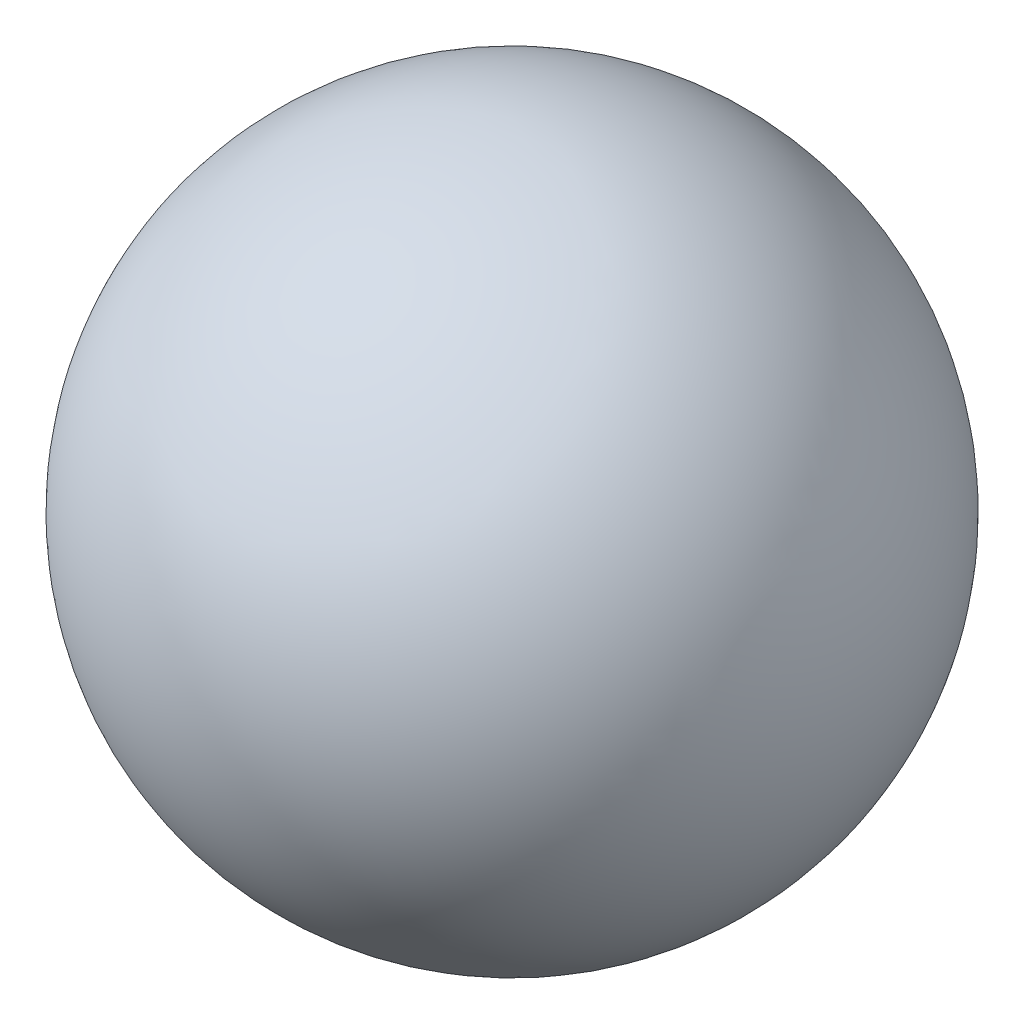
ISO-10303-21;
HEADER;
FILE_DESCRIPTION(('STEP AP214'),'2;1');
FILE_NAME('part.step','',(''),(''),'','','');
FILE_SCHEMA(('AUTOMOTIVE_DESIGN { 1 0 10303 214 1 1 1 1 }'));
ENDSEC;
DATA;
#1=APPLICATION_CONTEXT('core data for automotive mechanical design processes');
#2=APPLICATION_PROTOCOL_DEFINITION('international standard','automotive_design',2000,#1);
#3=PRODUCT_CONTEXT('',#1,'mechanical');
#4=PRODUCT('Part','Part','',(#3));
#5=PRODUCT_RELATED_PRODUCT_CATEGORY('part','',(#4));
#6=PRODUCT_DEFINITION_FORMATION('','',#4);
#7=PRODUCT_DEFINITION_CONTEXT('part definition',#1,'design');
#8=PRODUCT_DEFINITION('design','',#6,#7);
#9=PRODUCT_DEFINITION_SHAPE('','',#8);
#10=(LENGTH_UNIT() NAMED_UNIT(*) SI_UNIT(.MILLI.,.METRE.));
#11=(NAMED_UNIT(*) PLANE_ANGLE_UNIT() SI_UNIT($,.RADIAN.));
#12=(NAMED_UNIT(*) SI_UNIT($,.STERADIAN.) SOLID_ANGLE_UNIT());
#13=UNCERTAINTY_MEASURE_WITH_UNIT(LENGTH_MEASURE(1.E-05),#10,'distance_accuracy_value','');
#14=(GEOMETRIC_REPRESENTATION_CONTEXT(3) GLOBAL_UNCERTAINTY_ASSIGNED_CONTEXT((#13)) GLOBAL_UNIT_ASSIGNED_CONTEXT((#10,
#11,#12)) REPRESENTATION_CONTEXT('',''));
#15=CARTESIAN_POINT('',(0.,0.,0.));
#16=DIRECTION('',(0.,0.,1.));
#17=DIRECTION('',(1.,0.,0.));
#18=AXIS2_PLACEMENT_3D('',#15,#16,#17);
#19=CARTESIAN_POINT('',(4.7,0.,-4.2));
#20=DIRECTION('',(-1.,0.,0.));
#21=DIRECTION('',(0.,0.,1.));
#22=AXIS2_PLACEMENT_3D('',#19,#20,#21);
#23=SPHERICAL_SURFACE('',#22,2.7);
#24=CARTESIAN_POINT('',(2.,0.,-4.2));
#25=VERTEX_POINT('',#24);
#26=VERTEX_LOOP('',#25);
#27=FACE_BOUND('',#26,.T.);
#28=ADVANCED_FACE('F27',(#27),#23,.T.);
#29=CLOSED_SHELL('',(#28));
#30=MANIFOLD_SOLID_BREP('B2',#29);
#31=ADVANCED_BREP_SHAPE_REPRESENTATION('',(#18,#30),#14);
#32=SHAPE_DEFINITION_REPRESENTATION(#9,#31);
ENDSEC;
END-ISO-10303-21;
